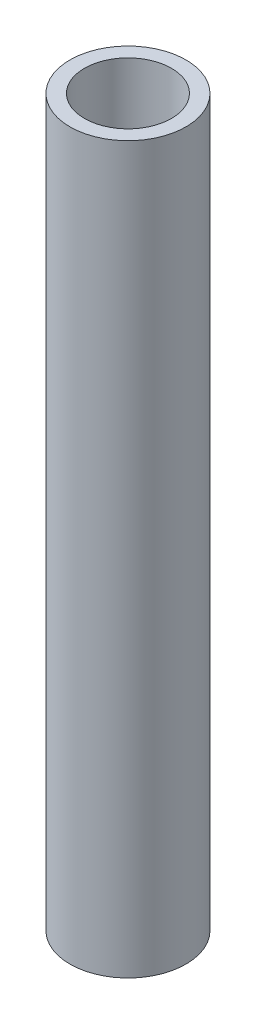
ISO-10303-21;
HEADER;
FILE_DESCRIPTION(('STEP AP214'),'2;1');
FILE_NAME('part.step','',(''),(''),'','','');
FILE_SCHEMA(('AUTOMOTIVE_DESIGN { 1 0 10303 214 1 1 1 1 }'));
ENDSEC;
DATA;
#1=APPLICATION_CONTEXT('core data for automotive mechanical design processes');
#2=APPLICATION_PROTOCOL_DEFINITION('international standard','automotive_design',2000,#1);
#3=PRODUCT_CONTEXT('',#1,'mechanical');
#4=PRODUCT('Part','Part','',(#3));
#5=PRODUCT_RELATED_PRODUCT_CATEGORY('part','',(#4));
#6=PRODUCT_DEFINITION_FORMATION('','',#4);
#7=PRODUCT_DEFINITION_CONTEXT('part definition',#1,'design');
#8=PRODUCT_DEFINITION('design','',#6,#7);
#9=PRODUCT_DEFINITION_SHAPE('','',#8);
#10=(LENGTH_UNIT() NAMED_UNIT(*) SI_UNIT(.MILLI.,.METRE.));
#11=(NAMED_UNIT(*) PLANE_ANGLE_UNIT() SI_UNIT($,.RADIAN.));
#12=(NAMED_UNIT(*) SI_UNIT($,.STERADIAN.) SOLID_ANGLE_UNIT());
#13=UNCERTAINTY_MEASURE_WITH_UNIT(LENGTH_MEASURE(1.E-05),#10,'distance_accuracy_value','');
#14=(GEOMETRIC_REPRESENTATION_CONTEXT(3) GLOBAL_UNCERTAINTY_ASSIGNED_CONTEXT((#13)) GLOBAL_UNIT_ASSIGNED_CONTEXT((#10,
#11,#12)) REPRESENTATION_CONTEXT('',''));
#15=CARTESIAN_POINT('',(0.,0.,0.));
#16=DIRECTION('',(0.,0.,1.));
#17=DIRECTION('',(1.,0.,0.));
#18=AXIS2_PLACEMENT_3D('',#15,#16,#17);
#19=CARTESIAN_POINT('',(0.,50.,0.));
#20=DIRECTION('',(0.,1.,0.));
#21=DIRECTION('',(0.,0.,1.));
#22=AXIS2_PLACEMENT_3D('',#19,#20,#21);
#23=PLANE('',#22);
#24=CARTESIAN_POINT('',(0.,50.,0.));
#25=DIRECTION('',(0.,1.,0.));
#26=DIRECTION('',(0.,0.,1.));
#27=AXIS2_PLACEMENT_3D('',#24,#25,#26);
#28=CIRCLE('',#27,8.);
#29=CARTESIAN_POINT('',(0.,50.,8.));
#30=VERTEX_POINT('',#29);
#31=EDGE_CURVE('E10',#30,#30,#28,.T.);
#32=ORIENTED_EDGE('',*,*,#31,.T.);
#33=EDGE_LOOP('',(#32));
#34=FACE_BOUND('',#33,.T.);
#35=CARTESIAN_POINT('',(0.,50.,0.));
#36=DIRECTION('',(0.,1.,0.));
#37=DIRECTION('',(0.,0.,1.));
#38=AXIS2_PLACEMENT_3D('',#35,#36,#37);
#39=CIRCLE('',#38,6.);
#40=CARTESIAN_POINT('',(0.,50.,6.));
#41=VERTEX_POINT('',#40);
#42=EDGE_CURVE('E41',#41,#41,#39,.T.);
#43=ORIENTED_EDGE('',*,*,#42,.F.);
#44=EDGE_LOOP('',(#43));
#45=FACE_BOUND('',#44,.T.);
#46=ADVANCED_FACE('F30',(#34,#45),#23,.T.);
#47=CARTESIAN_POINT('',(0.,-50.,0.));
#48=DIRECTION('',(0.,1.,0.));
#49=DIRECTION('',(0.,0.,1.));
#50=AXIS2_PLACEMENT_3D('',#47,#48,#49);
#51=PLANE('',#50);
#52=CARTESIAN_POINT('',(0.,-50.,0.));
#53=DIRECTION('',(0.,1.,0.));
#54=DIRECTION('',(0.,0.,1.));
#55=AXIS2_PLACEMENT_3D('',#52,#53,#54);
#56=CIRCLE('',#55,8.);
#57=CARTESIAN_POINT('',(0.,-50.,8.));
#58=VERTEX_POINT('',#57);
#59=EDGE_CURVE('E34',#58,#58,#56,.T.);
#60=ORIENTED_EDGE('',*,*,#59,.F.);
#61=EDGE_LOOP('',(#60));
#62=FACE_BOUND('',#61,.T.);
#63=CARTESIAN_POINT('',(0.,-50.,0.));
#64=DIRECTION('',(0.,1.,0.));
#65=DIRECTION('',(0.,0.,1.));
#66=AXIS2_PLACEMENT_3D('',#63,#64,#65);
#67=CIRCLE('',#66,6.);
#68=CARTESIAN_POINT('',(0.,-50.,6.));
#69=VERTEX_POINT('',#68);
#70=EDGE_CURVE('E43',#69,#69,#67,.T.);
#71=ORIENTED_EDGE('',*,*,#70,.T.);
#72=EDGE_LOOP('',(#71));
#73=FACE_BOUND('',#72,.T.);
#74=ADVANCED_FACE('F53',(#62,#73),#51,.F.);
#75=CARTESIAN_POINT('',(0.,50.,0.));
#76=DIRECTION('',(0.,-1.,0.));
#77=DIRECTION('',(0.,0.,-1.));
#78=AXIS2_PLACEMENT_3D('',#75,#76,#77);
#79=CYLINDRICAL_SURFACE('',#78,8.);
#80=ORIENTED_EDGE('',*,*,#31,.F.);
#81=EDGE_LOOP('',(#80));
#82=FACE_BOUND('',#81,.T.);
#83=ORIENTED_EDGE('',*,*,#59,.T.);
#84=EDGE_LOOP('',(#83));
#85=FACE_BOUND('',#84,.T.);
#86=ADVANCED_FACE('F32',(#82,#85),#79,.T.);
#87=CARTESIAN_POINT('',(0.,50.,0.));
#88=DIRECTION('',(0.,-1.,0.));
#89=DIRECTION('',(0.,0.,-1.));
#90=AXIS2_PLACEMENT_3D('',#87,#88,#89);
#91=CYLINDRICAL_SURFACE('',#90,6.);
#92=ORIENTED_EDGE('',*,*,#42,.T.);
#93=EDGE_LOOP('',(#92));
#94=FACE_BOUND('',#93,.T.);
#95=ORIENTED_EDGE('',*,*,#70,.F.);
#96=EDGE_LOOP('',(#95));
#97=FACE_BOUND('',#96,.T.);
#98=ADVANCED_FACE('F49',(#94,#97),#91,.F.);
#99=CLOSED_SHELL('',(#46,#74,#86,#98));
#100=MANIFOLD_SOLID_BREP('B2',#99);
#101=ADVANCED_BREP_SHAPE_REPRESENTATION('',(#18,#100),#14);
#102=SHAPE_DEFINITION_REPRESENTATION(#9,#101);
ENDSEC;
END-ISO-10303-21;
